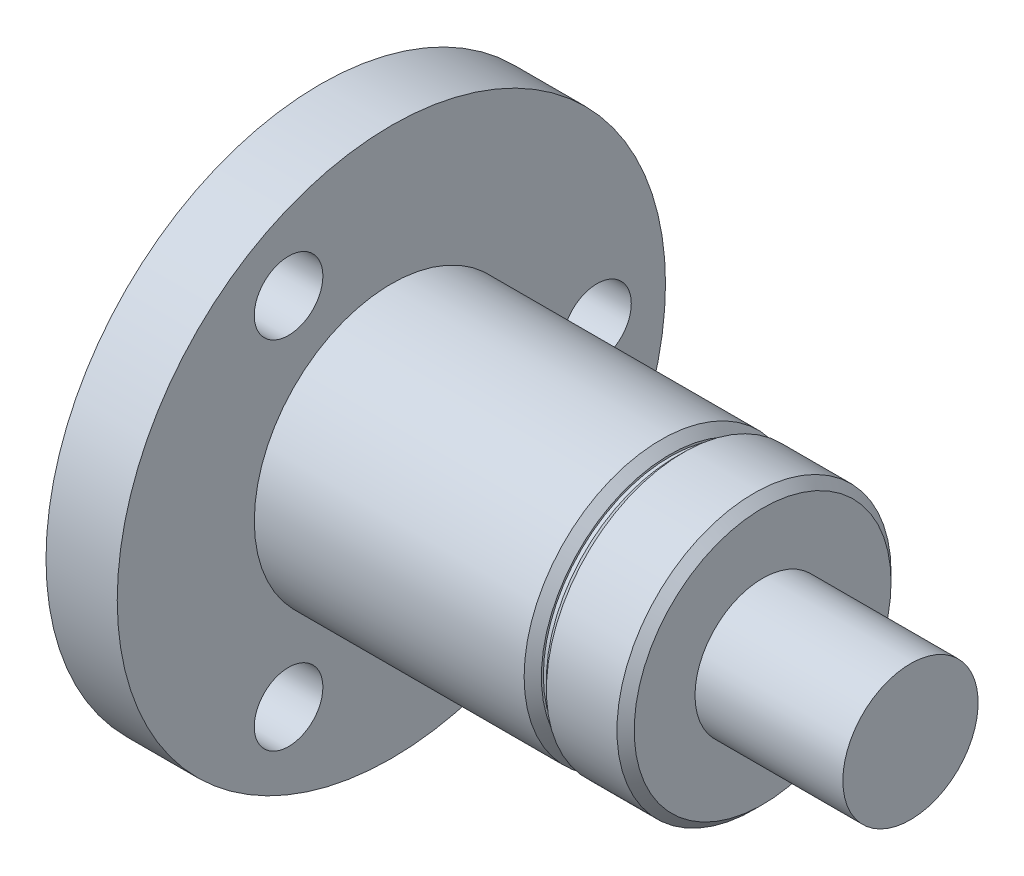
ISO-10303-21;
HEADER;
FILE_DESCRIPTION(('STEP AP214'),'2;1');
FILE_NAME('part.step','',(''),(''),'','','');
FILE_SCHEMA(('AUTOMOTIVE_DESIGN { 1 0 10303 214 1 1 1 1 }'));
ENDSEC;
DATA;
#1=APPLICATION_CONTEXT('core data for automotive mechanical design processes');
#2=APPLICATION_PROTOCOL_DEFINITION('international standard','automotive_design',2000,#1);
#3=PRODUCT_CONTEXT('',#1,'mechanical');
#4=PRODUCT('Part','Part','',(#3));
#5=PRODUCT_RELATED_PRODUCT_CATEGORY('part','',(#4));
#6=PRODUCT_DEFINITION_FORMATION('','',#4);
#7=PRODUCT_DEFINITION_CONTEXT('part definition',#1,'design');
#8=PRODUCT_DEFINITION('design','',#6,#7);
#9=PRODUCT_DEFINITION_SHAPE('','',#8);
#10=(LENGTH_UNIT() NAMED_UNIT(*) SI_UNIT(.MILLI.,.METRE.));
#11=(NAMED_UNIT(*) PLANE_ANGLE_UNIT() SI_UNIT($,.RADIAN.));
#12=(NAMED_UNIT(*) SI_UNIT($,.STERADIAN.) SOLID_ANGLE_UNIT());
#13=UNCERTAINTY_MEASURE_WITH_UNIT(LENGTH_MEASURE(1.E-05),#10,'distance_accuracy_value','');
#14=(GEOMETRIC_REPRESENTATION_CONTEXT(3) GLOBAL_UNCERTAINTY_ASSIGNED_CONTEXT((#13)) GLOBAL_UNIT_ASSIGNED_CONTEXT((#10,
#11,#12)) REPRESENTATION_CONTEXT('',''));
#15=CARTESIAN_POINT('',(0.,0.,0.));
#16=DIRECTION('',(0.,0.,1.));
#17=DIRECTION('',(1.,0.,0.));
#18=AXIS2_PLACEMENT_3D('',#15,#16,#17);
#19=CARTESIAN_POINT('',(-9.6,0.,0.));
#20=DIRECTION('',(1.,0.,0.));
#21=DIRECTION('',(0.,0.,-1.));
#22=AXIS2_PLACEMENT_3D('',#19,#20,#21);
#23=PLANE('',#22);
#24=CARTESIAN_POINT('',(-9.6,0.,0.));
#25=DIRECTION('',(-1.,0.,0.));
#26=DIRECTION('',(0.,0.,1.));
#27=AXIS2_PLACEMENT_3D('',#24,#25,#26);
#28=CIRCLE('',#27,3.13359790887331);
#29=CARTESIAN_POINT('',(-9.6,0.,3.13359790887331));
#30=VERTEX_POINT('',#29);
#31=EDGE_CURVE('E75',#30,#30,#28,.T.);
#32=ORIENTED_EDGE('',*,*,#31,.T.);
#33=EDGE_LOOP('',(#32));
#34=FACE_BOUND('',#33,.T.);
#35=ADVANCED_FACE('F37',(#34),#23,.F.);
#36=CARTESIAN_POINT('',(24.05,0.,0.));
#37=DIRECTION('',(-1.,0.,0.));
#38=DIRECTION('',(0.,0.,1.));
#39=AXIS2_PLACEMENT_3D('',#36,#37,#38);
#40=PLANE('',#39);
#41=CARTESIAN_POINT('',(24.05,0.,0.));
#42=DIRECTION('',(-1.,0.,0.));
#43=DIRECTION('',(0.,0.,1.));
#44=AXIS2_PLACEMENT_3D('',#41,#42,#43);
#45=CIRCLE('',#44,3.13359790887331);
#46=CARTESIAN_POINT('',(24.05,0.,3.13359790887331));
#47=VERTEX_POINT('',#46);
#48=EDGE_CURVE('E63',#47,#47,#45,.T.);
#49=ORIENTED_EDGE('',*,*,#48,.F.);
#50=EDGE_LOOP('',(#49));
#51=FACE_BOUND('',#50,.T.);
#52=ADVANCED_FACE('F135',(#51),#40,.F.);
#53=CARTESIAN_POINT('',(-3.3,0.,0.));
#54=DIRECTION('',(-1.,0.,0.));
#55=DIRECTION('',(0.,0.,1.));
#56=AXIS2_PLACEMENT_3D('',#53,#54,#55);
#57=CYLINDRICAL_SURFACE('',#56,3.13359790887331);
#58=ORIENTED_EDGE('',*,*,#48,.T.);
#59=EDGE_LOOP('',(#58));
#60=FACE_BOUND('',#59,.T.);
#61=CARTESIAN_POINT('',(17.2,0.,0.));
#62=DIRECTION('',(-1.,0.,0.));
#63=DIRECTION('',(0.,0.,1.));
#64=AXIS2_PLACEMENT_3D('',#61,#62,#63);
#65=CIRCLE('',#64,3.13359790887331);
#66=CARTESIAN_POINT('',(17.2,0.,3.13359790887331));
#67=VERTEX_POINT('',#66);
#68=EDGE_CURVE('E78',#67,#67,#65,.T.);
#69=ORIENTED_EDGE('',*,*,#68,.F.);
#70=EDGE_LOOP('',(#69));
#71=FACE_BOUND('',#70,.T.);
#72=ADVANCED_FACE('F141',(#60,#71),#57,.T.);
#73=CARTESIAN_POINT('',(17.2,0.,0.));
#74=DIRECTION('',(1.,0.,0.));
#75=DIRECTION('',(0.,0.,-1.));
#76=AXIS2_PLACEMENT_3D('',#73,#74,#75);
#77=PLANE('',#76);
#78=CARTESIAN_POINT('',(17.2,0.,0.));
#79=DIRECTION('',(1.,0.,0.));
#80=DIRECTION('',(0.,0.,-1.));
#81=AXIS2_PLACEMENT_3D('',#78,#79,#80);
#82=CIRCLE('',#81,5.94999999999999);
#83=CARTESIAN_POINT('',(17.2,0.,-5.94999999999999));
#84=VERTEX_POINT('',#83);
#85=EDGE_CURVE('E52',#84,#84,#82,.T.);
#86=ORIENTED_EDGE('',*,*,#85,.T.);
#87=EDGE_LOOP('',(#86));
#88=FACE_BOUND('',#87,.T.);
#89=ORIENTED_EDGE('',*,*,#68,.T.);
#90=EDGE_LOOP('',(#89));
#91=FACE_BOUND('',#90,.T.);
#92=ADVANCED_FACE('F177',(#88,#91),#77,.T.);
#93=CARTESIAN_POINT('',(-3.3,0.,0.));
#94=DIRECTION('',(-1.,0.,0.));
#95=DIRECTION('',(0.,0.,1.));
#96=AXIS2_PLACEMENT_3D('',#93,#94,#95);
#97=CYLINDRICAL_SURFACE('',#96,6.35);
#98=CARTESIAN_POINT('',(16.8,0.,0.));
#99=DIRECTION('',(1.,0.,0.));
#100=DIRECTION('',(0.,0.,-1.));
#101=AXIS2_PLACEMENT_3D('',#98,#99,#100);
#102=CIRCLE('',#101,6.35);
#103=CARTESIAN_POINT('',(16.8,0.,-6.35));
#104=VERTEX_POINT('',#103);
#105=EDGE_CURVE('E57',#104,#104,#102,.F.);
#106=ORIENTED_EDGE('',*,*,#105,.T.);
#107=EDGE_LOOP('',(#106));
#108=FACE_BOUND('',#107,.T.);
#109=CARTESIAN_POINT('',(13.5322318788082,0.,0.));
#110=DIRECTION('',(-1.,0.,0.));
#111=DIRECTION('',(0.,0.,1.));
#112=AXIS2_PLACEMENT_3D('',#109,#110,#111);
#113=CIRCLE('',#112,6.35);
#114=CARTESIAN_POINT('',(13.5322318788082,0.,-6.35));
#115=VERTEX_POINT('',#114);
#116=EDGE_CURVE('E60',#115,#115,#113,.F.);
#117=ORIENTED_EDGE('',*,*,#116,.T.);
#118=EDGE_LOOP('',(#117));
#119=FACE_BOUND('',#118,.T.);
#120=ADVANCED_FACE('F163',(#108,#119),#97,.T.);
#121=CARTESIAN_POINT('',(13.1322318788082,0.,0.));
#122=DIRECTION('',(-1.,0.,0.));
#123=DIRECTION('',(0.,0.,1.));
#124=AXIS2_PLACEMENT_3D('',#121,#122,#123);
#125=PLANE('',#124);
#126=CARTESIAN_POINT('',(13.1322318788082,0.,0.));
#127=DIRECTION('',(-1.,0.,0.));
#128=DIRECTION('',(0.,0.,1.));
#129=AXIS2_PLACEMENT_3D('',#126,#127,#128);
#130=CIRCLE('',#129,5.95000000000002);
#131=CARTESIAN_POINT('',(13.1322318788082,0.,-5.95000000000002));
#132=VERTEX_POINT('',#131);
#133=EDGE_CURVE('E48',#132,#132,#130,.T.);
#134=ORIENTED_EDGE('',*,*,#133,.T.);
#135=EDGE_LOOP('',(#134));
#136=FACE_BOUND('',#135,.T.);
#137=CARTESIAN_POINT('',(13.1322318788082,0.,0.));
#138=DIRECTION('',(-1.,0.,0.));
#139=DIRECTION('',(0.,0.,1.));
#140=AXIS2_PLACEMENT_3D('',#137,#138,#139);
#141=CIRCLE('',#140,5.85946934559331);
#142=CARTESIAN_POINT('',(13.1322318788082,0.,5.85946934559331));
#143=VERTEX_POINT('',#142);
#144=EDGE_CURVE('E81',#143,#143,#141,.T.);
#145=ORIENTED_EDGE('',*,*,#144,.F.);
#146=EDGE_LOOP('',(#145));
#147=FACE_BOUND('',#146,.T.);
#148=ADVANCED_FACE('F160',(#136,#147),#125,.T.);
#149=CARTESIAN_POINT('',(-3.3,0.,0.));
#150=DIRECTION('',(-1.,0.,0.));
#151=DIRECTION('',(0.,0.,1.));
#152=AXIS2_PLACEMENT_3D('',#149,#150,#151);
#153=CYLINDRICAL_SURFACE('',#152,5.85946934559331);
#154=ORIENTED_EDGE('',*,*,#144,.T.);
#155=EDGE_LOOP('',(#154));
#156=FACE_BOUND('',#155,.T.);
#157=CARTESIAN_POINT('',(12.9,0.,0.));
#158=DIRECTION('',(-1.,0.,0.));
#159=DIRECTION('',(0.,0.,1.));
#160=AXIS2_PLACEMENT_3D('',#157,#158,#159);
#161=CIRCLE('',#160,5.85946934559331);
#162=CARTESIAN_POINT('',(12.9,0.,5.85946934559331));
#163=VERTEX_POINT('',#162);
#164=EDGE_CURVE('E84',#163,#163,#161,.T.);
#165=ORIENTED_EDGE('',*,*,#164,.F.);
#166=EDGE_LOOP('',(#165));
#167=FACE_BOUND('',#166,.T.);
#168=ADVANCED_FACE('F132',(#156,#167),#153,.T.);
#169=CARTESIAN_POINT('',(12.9,0.,0.));
#170=DIRECTION('',(1.,0.,0.));
#171=DIRECTION('',(0.,0.,-1.));
#172=AXIS2_PLACEMENT_3D('',#169,#170,#171);
#173=PLANE('',#172);
#174=CARTESIAN_POINT('',(12.9,0.,0.));
#175=DIRECTION('',(1.,0.,0.));
#176=DIRECTION('',(0.,0.,-1.));
#177=AXIS2_PLACEMENT_3D('',#174,#175,#176);
#178=CIRCLE('',#177,5.95);
#179=CARTESIAN_POINT('',(12.9,0.,-5.95));
#180=VERTEX_POINT('',#179);
#181=EDGE_CURVE('E10',#180,#180,#178,.T.);
#182=ORIENTED_EDGE('',*,*,#181,.T.);
#183=EDGE_LOOP('',(#182));
#184=FACE_BOUND('',#183,.T.);
#185=ORIENTED_EDGE('',*,*,#164,.T.);
#186=EDGE_LOOP('',(#185));
#187=FACE_BOUND('',#186,.T.);
#188=ADVANCED_FACE('F127',(#184,#187),#173,.T.);
#189=CARTESIAN_POINT('',(-3.3,0.,0.));
#190=DIRECTION('',(-1.,0.,0.));
#191=DIRECTION('',(0.,0.,1.));
#192=AXIS2_PLACEMENT_3D('',#189,#190,#191);
#193=CYLINDRICAL_SURFACE('',#192,6.35);
#194=CARTESIAN_POINT('',(12.5,0.,0.));
#195=DIRECTION('',(1.,0.,0.));
#196=DIRECTION('',(0.,0.,-1.));
#197=AXIS2_PLACEMENT_3D('',#194,#195,#196);
#198=CIRCLE('',#197,6.35);
#199=CARTESIAN_POINT('',(12.5,0.,-6.35));
#200=VERTEX_POINT('',#199);
#201=EDGE_CURVE('E44',#200,#200,#198,.F.);
#202=ORIENTED_EDGE('',*,*,#201,.T.);
#203=EDGE_LOOP('',(#202));
#204=FACE_BOUND('',#203,.T.);
#205=CARTESIAN_POINT('',(0.,0.,0.));
#206=DIRECTION('',(-1.,0.,0.));
#207=DIRECTION('',(0.,0.,1.));
#208=AXIS2_PLACEMENT_3D('',#205,#206,#207);
#209=CIRCLE('',#208,6.35);
#210=CARTESIAN_POINT('',(0.,0.,6.35));
#211=VERTEX_POINT('',#210);
#212=EDGE_CURVE('E87',#211,#211,#209,.T.);
#213=ORIENTED_EDGE('',*,*,#212,.F.);
#214=EDGE_LOOP('',(#213));
#215=FACE_BOUND('',#214,.T.);
#216=ADVANCED_FACE('F116',(#204,#215),#193,.T.);
#217=CARTESIAN_POINT('',(0.,0.,0.));
#218=DIRECTION('',(-1.,0.,0.));
#219=DIRECTION('',(0.,0.,1.));
#220=AXIS2_PLACEMENT_3D('',#217,#218,#219);
#221=PLANE('',#220);
#222=CARTESIAN_POINT('',(0.,-8.24889197104676,4.76250000000004));
#223=DIRECTION('',(1.,0.,0.));
#224=DIRECTION('',(0.,-0.866025403784436,0.500000000000004));
#225=AXIS2_PLACEMENT_3D('',#222,#223,#224);
#226=CIRCLE('',#225,1.59);
#227=CARTESIAN_POINT('',(0.,-9.62587236306401,5.55750000000005));
#228=VERTEX_POINT('',#227);
#229=EDGE_CURVE('E71',#228,#228,#226,.T.);
#230=ORIENTED_EDGE('',*,*,#229,.F.);
#231=EDGE_LOOP('',(#230));
#232=FACE_BOUND('',#231,.T.);
#233=CARTESIAN_POINT('',(0.,8.24889197104682,4.76249999999992));
#234=DIRECTION('',(1.,0.,0.));
#235=DIRECTION('',(0.,0.866025403784443,0.499999999999992));
#236=AXIS2_PLACEMENT_3D('',#233,#234,#235);
#237=CIRCLE('',#236,1.59);
#238=CARTESIAN_POINT('',(0.,9.62587236306409,5.55749999999991));
#239=VERTEX_POINT('',#238);
#240=EDGE_CURVE('E103',#239,#239,#237,.T.);
#241=ORIENTED_EDGE('',*,*,#240,.F.);
#242=EDGE_LOOP('',(#241));
#243=FACE_BOUND('',#242,.T.);
#244=CARTESIAN_POINT('',(0.,0.,-9.525));
#245=DIRECTION('',(1.,0.,0.));
#246=DIRECTION('',(0.,0.,-1.));
#247=AXIS2_PLACEMENT_3D('',#244,#245,#246);
#248=CIRCLE('',#247,1.59);
#249=CARTESIAN_POINT('',(0.,0.,-11.115));
#250=VERTEX_POINT('',#249);
#251=EDGE_CURVE('E67',#250,#250,#248,.T.);
#252=ORIENTED_EDGE('',*,*,#251,.F.);
#253=EDGE_LOOP('',(#252));
#254=FACE_BOUND('',#253,.T.);
#255=CARTESIAN_POINT('',(0.,0.,0.));
#256=DIRECTION('',(-1.,0.,0.));
#257=DIRECTION('',(0.,0.,1.));
#258=AXIS2_PLACEMENT_3D('',#255,#256,#257);
#259=CIRCLE('',#258,12.7);
#260=CARTESIAN_POINT('',(0.,0.,12.7));
#261=VERTEX_POINT('',#260);
#262=EDGE_CURVE('E90',#261,#261,#259,.T.);
#263=ORIENTED_EDGE('',*,*,#262,.F.);
#264=EDGE_LOOP('',(#263));
#265=FACE_BOUND('',#264,.T.);
#266=ORIENTED_EDGE('',*,*,#212,.T.);
#267=EDGE_LOOP('',(#266));
#268=FACE_BOUND('',#267,.T.);
#269=ADVANCED_FACE('F112',(#232,#243,#254,#265,#268),#221,.F.);
#270=CARTESIAN_POINT('',(-3.3,0.,0.));
#271=DIRECTION('',(-1.,0.,0.));
#272=DIRECTION('',(0.,0.,1.));
#273=AXIS2_PLACEMENT_3D('',#270,#271,#272);
#274=CYLINDRICAL_SURFACE('',#273,12.7);
#275=CARTESIAN_POINT('',(-3.3,0.,0.));
#276=DIRECTION('',(-1.,0.,0.));
#277=DIRECTION('',(0.,0.,1.));
#278=AXIS2_PLACEMENT_3D('',#275,#276,#277);
#279=CIRCLE('',#278,12.7);
#280=CARTESIAN_POINT('',(-3.3,0.,12.7));
#281=VERTEX_POINT('',#280);
#282=EDGE_CURVE('E93',#281,#281,#279,.T.);
#283=ORIENTED_EDGE('',*,*,#282,.F.);
#284=EDGE_LOOP('',(#283));
#285=FACE_BOUND('',#284,.T.);
#286=ORIENTED_EDGE('',*,*,#262,.T.);
#287=EDGE_LOOP('',(#286));
#288=FACE_BOUND('',#287,.T.);
#289=ADVANCED_FACE('F115',(#285,#288),#274,.T.);
#290=CARTESIAN_POINT('',(-3.3,0.,0.));
#291=DIRECTION('',(1.,0.,0.));
#292=DIRECTION('',(0.,0.,-1.));
#293=AXIS2_PLACEMENT_3D('',#290,#291,#292);
#294=PLANE('',#293);
#295=CARTESIAN_POINT('',(-3.3,-8.24889197104676,4.76250000000004));
#296=DIRECTION('',(1.,0.,0.));
#297=DIRECTION('',(0.,0.,-1.));
#298=AXIS2_PLACEMENT_3D('',#295,#296,#297);
#299=CIRCLE('',#298,1.59);
#300=CARTESIAN_POINT('',(-3.3,-8.24889197104676,3.17250000000004));
#301=VERTEX_POINT('',#300);
#302=EDGE_CURVE('E64',#301,#301,#299,.T.);
#303=ORIENTED_EDGE('',*,*,#302,.T.);
#304=EDGE_LOOP('',(#303));
#305=FACE_BOUND('',#304,.T.);
#306=CARTESIAN_POINT('',(-3.3,8.24889197104682,4.76249999999992));
#307=DIRECTION('',(1.,0.,0.));
#308=DIRECTION('',(0.,0.,-1.));
#309=AXIS2_PLACEMENT_3D('',#306,#307,#308);
#310=CIRCLE('',#309,1.59);
#311=CARTESIAN_POINT('',(-3.3,8.24889197104682,3.17249999999992));
#312=VERTEX_POINT('',#311);
#313=EDGE_CURVE('E68',#312,#312,#310,.T.);
#314=ORIENTED_EDGE('',*,*,#313,.T.);
#315=EDGE_LOOP('',(#314));
#316=FACE_BOUND('',#315,.T.);
#317=CARTESIAN_POINT('',(-3.3,0.,-9.525));
#318=DIRECTION('',(1.,0.,0.));
#319=DIRECTION('',(0.,0.,-1.));
#320=AXIS2_PLACEMENT_3D('',#317,#318,#319);
#321=CIRCLE('',#320,1.59);
#322=CARTESIAN_POINT('',(-3.3,0.,-11.115));
#323=VERTEX_POINT('',#322);
#324=EDGE_CURVE('E72',#323,#323,#321,.T.);
#325=ORIENTED_EDGE('',*,*,#324,.T.);
#326=EDGE_LOOP('',(#325));
#327=FACE_BOUND('',#326,.T.);
#328=CARTESIAN_POINT('',(-3.3,0.,0.));
#329=DIRECTION('',(-1.,0.,0.));
#330=DIRECTION('',(0.,0.,1.));
#331=AXIS2_PLACEMENT_3D('',#328,#329,#330);
#332=CIRCLE('',#331,3.13359790887331);
#333=CARTESIAN_POINT('',(-3.3,0.,3.13359790887331));
#334=VERTEX_POINT('',#333);
#335=EDGE_CURVE('E96',#334,#334,#332,.T.);
#336=ORIENTED_EDGE('',*,*,#335,.F.);
#337=EDGE_LOOP('',(#336));
#338=FACE_BOUND('',#337,.T.);
#339=ORIENTED_EDGE('',*,*,#282,.T.);
#340=EDGE_LOOP('',(#339));
#341=FACE_BOUND('',#340,.T.);
#342=ADVANCED_FACE('F264',(#305,#316,#327,#338,#341),#294,.F.);
#343=CARTESIAN_POINT('',(-3.3,0.,0.));
#344=DIRECTION('',(-1.,0.,0.));
#345=DIRECTION('',(0.,0.,1.));
#346=AXIS2_PLACEMENT_3D('',#343,#344,#345);
#347=CYLINDRICAL_SURFACE('',#346,3.13359790887331);
#348=ORIENTED_EDGE('',*,*,#335,.T.);
#349=EDGE_LOOP('',(#348));
#350=FACE_BOUND('',#349,.T.);
#351=ORIENTED_EDGE('',*,*,#31,.F.);
#352=EDGE_LOOP('',(#351));
#353=FACE_BOUND('',#352,.T.);
#354=ADVANCED_FACE('F255',(#350,#353),#347,.T.);
#355=CARTESIAN_POINT('',(-10.,0.,-9.525));
#356=DIRECTION('',(1.,0.,0.));
#357=DIRECTION('',(0.,0.,-1.));
#358=AXIS2_PLACEMENT_3D('',#355,#356,#357);
#359=CYLINDRICAL_SURFACE('',#358,1.59);
#360=ORIENTED_EDGE('',*,*,#251,.T.);
#361=EDGE_LOOP('',(#360));
#362=FACE_BOUND('',#361,.T.);
#363=ORIENTED_EDGE('',*,*,#324,.F.);
#364=EDGE_LOOP('',(#363));
#365=FACE_BOUND('',#364,.T.);
#366=ADVANCED_FACE('F246',(#362,#365),#359,.F.);
#367=CARTESIAN_POINT('',(-10.,8.24889197104682,4.76249999999992));
#368=DIRECTION('',(1.,0.,0.));
#369=DIRECTION('',(0.,0.,-1.));
#370=AXIS2_PLACEMENT_3D('',#367,#368,#369);
#371=CYLINDRICAL_SURFACE('',#370,1.59);
#372=ORIENTED_EDGE('',*,*,#240,.T.);
#373=EDGE_LOOP('',(#372));
#374=FACE_BOUND('',#373,.T.);
#375=ORIENTED_EDGE('',*,*,#313,.F.);
#376=EDGE_LOOP('',(#375));
#377=FACE_BOUND('',#376,.T.);
#378=ADVANCED_FACE('F240',(#374,#377),#371,.F.);
#379=CARTESIAN_POINT('',(-10.,-8.24889197104676,4.76250000000004));
#380=DIRECTION('',(1.,0.,0.));
#381=DIRECTION('',(0.,0.,-1.));
#382=AXIS2_PLACEMENT_3D('',#379,#380,#381);
#383=CYLINDRICAL_SURFACE('',#382,1.59);
#384=ORIENTED_EDGE('',*,*,#229,.T.);
#385=EDGE_LOOP('',(#384));
#386=FACE_BOUND('',#385,.T.);
#387=ORIENTED_EDGE('',*,*,#302,.F.);
#388=EDGE_LOOP('',(#387));
#389=FACE_BOUND('',#388,.T.);
#390=ADVANCED_FACE('F109',(#386,#389),#383,.F.);
#391=CARTESIAN_POINT('',(16.8,0.,0.));
#392=DIRECTION('',(-1.,0.,0.));
#393=DIRECTION('',(0.,0.,1.));
#394=AXIS2_PLACEMENT_3D('',#391,#392,#393);
#395=CONICAL_SURFACE('',#394,6.35,0.785398163397446);
#396=ORIENTED_EDGE('',*,*,#85,.F.);
#397=EDGE_LOOP('',(#396));
#398=FACE_BOUND('',#397,.T.);
#399=ORIENTED_EDGE('',*,*,#105,.F.);
#400=EDGE_LOOP('',(#399));
#401=FACE_BOUND('',#400,.T.);
#402=ADVANCED_FACE('F146',(#398,#401),#395,.T.);
#403=CARTESIAN_POINT('',(13.1322318788082,0.,0.));
#404=DIRECTION('',(1.,0.,0.));
#405=DIRECTION('',(0.,0.,-1.));
#406=AXIS2_PLACEMENT_3D('',#403,#404,#405);
#407=CONICAL_SURFACE('',#406,5.95000000000002,0.785398163397442);
#408=CARTESIAN_POINT('',(13.5322318788082,0.,-6.35));
#409=CARTESIAN_POINT('',(13.5280652121416,0.,-6.34583333333333));
#410=CARTESIAN_POINT('',(13.5238985454749,0.,-6.34166666666667));
#411=CARTESIAN_POINT('',(13.5155652121416,0.,-6.33333333333333));
#412=CARTESIAN_POINT('',(13.5113985454749,0.,-6.32916666666667));
#413=CARTESIAN_POINT('',(13.5030652121416,0.,-6.32083333333334));
#414=CARTESIAN_POINT('',(13.4988985454749,0.,-6.31666666666667));
#415=CARTESIAN_POINT('',(13.4905652121416,0.,-6.30833333333334));
#416=CARTESIAN_POINT('',(13.4863985454749,0.,-6.30416666666667));
#417=CARTESIAN_POINT('',(13.4780652121416,0.,-6.29583333333334));
#418=CARTESIAN_POINT('',(13.4738985454749,0.,-6.29166666666667));
#419=CARTESIAN_POINT('',(13.4655652121416,0.,-6.28333333333334));
#420=CARTESIAN_POINT('',(13.4613985454749,0.,-6.27916666666667));
#421=CARTESIAN_POINT('',(13.4530652121416,0.,-6.27083333333334));
#422=CARTESIAN_POINT('',(13.4488985454749,0.,-6.26666666666667));
#423=CARTESIAN_POINT('',(13.4405652121416,0.,-6.25833333333334));
#424=CARTESIAN_POINT('',(13.4363985454749,0.,-6.25416666666667));
#425=CARTESIAN_POINT('',(13.4280652121416,0.,-6.24583333333334));
#426=CARTESIAN_POINT('',(13.4238985454749,0.,-6.24166666666667));
#427=CARTESIAN_POINT('',(13.4155652121416,0.,-6.23333333333334));
#428=CARTESIAN_POINT('',(13.4113985454749,0.,-6.22916666666667));
#429=CARTESIAN_POINT('',(13.4030652121416,0.,-6.22083333333334));
#430=CARTESIAN_POINT('',(13.3988985454749,0.,-6.21666666666667));
#431=CARTESIAN_POINT('',(13.3905652121416,0.,-6.20833333333334));
#432=CARTESIAN_POINT('',(13.3863985454749,0.,-6.20416666666667));
#433=CARTESIAN_POINT('',(13.3780652121416,0.,-6.19583333333334));
#434=CARTESIAN_POINT('',(13.3738985454749,0.,-6.19166666666667));
#435=CARTESIAN_POINT('',(13.3655652121416,0.,-6.18333333333334));
#436=CARTESIAN_POINT('',(13.3613985454749,0.,-6.17916666666668));
#437=CARTESIAN_POINT('',(13.3530652121416,0.,-6.17083333333334));
#438=CARTESIAN_POINT('',(13.3488985454749,0.,-6.16666666666667));
#439=CARTESIAN_POINT('',(13.3405652121416,0.,-6.15833333333334));
#440=CARTESIAN_POINT('',(13.3363985454749,0.,-6.15416666666668));
#441=CARTESIAN_POINT('',(13.3280652121416,0.,-6.14583333333334));
#442=CARTESIAN_POINT('',(13.3238985454749,0.,-6.14166666666668));
#443=CARTESIAN_POINT('',(13.3155652121416,0.,-6.13333333333334));
#444=CARTESIAN_POINT('',(13.3113985454749,0.,-6.12916666666668));
#445=CARTESIAN_POINT('',(13.3030652121416,0.,-6.12083333333334));
#446=CARTESIAN_POINT('',(13.2988985454749,0.,-6.11666666666668));
#447=CARTESIAN_POINT('',(13.2905652121416,0.,-6.10833333333334));
#448=CARTESIAN_POINT('',(13.2863985454749,0.,-6.10416666666668));
#449=CARTESIAN_POINT('',(13.2780652121416,0.,-6.09583333333335));
#450=CARTESIAN_POINT('',(13.2738985454749,0.,-6.09166666666668));
#451=CARTESIAN_POINT('',(13.2655652121416,0.,-6.08333333333335));
#452=CARTESIAN_POINT('',(13.2613985454749,0.,-6.07916666666668));
#453=CARTESIAN_POINT('',(13.2530652121416,0.,-6.07083333333335));
#454=CARTESIAN_POINT('',(13.2488985454749,0.,-6.06666666666668));
#455=CARTESIAN_POINT('',(13.2405652121416,0.,-6.05833333333335));
#456=CARTESIAN_POINT('',(13.2363985454749,0.,-6.05416666666668));
#457=CARTESIAN_POINT('',(13.2280652121416,0.,-6.04583333333335));
#458=CARTESIAN_POINT('',(13.2238985454749,0.,-6.04166666666668));
#459=CARTESIAN_POINT('',(13.2155652121416,0.,-6.03333333333335));
#460=CARTESIAN_POINT('',(13.2113985454749,0.,-6.02916666666668));
#461=CARTESIAN_POINT('',(13.2030652121416,0.,-6.02083333333335));
#462=CARTESIAN_POINT('',(13.1988985454749,0.,-6.01666666666668));
#463=CARTESIAN_POINT('',(13.1905652121416,0.,-6.00833333333335));
#464=CARTESIAN_POINT('',(13.1863985454749,0.,-6.00416666666668));
#465=CARTESIAN_POINT('',(13.1780652121416,0.,-5.99583333333335));
#466=CARTESIAN_POINT('',(13.1738985454749,0.,-5.99166666666668));
#467=CARTESIAN_POINT('',(13.1655652121416,0.,-5.98333333333335));
#468=CARTESIAN_POINT('',(13.1613985454749,0.,-5.97916666666668));
#469=CARTESIAN_POINT('',(13.1530652121416,0.,-5.97083333333335));
#470=CARTESIAN_POINT('',(13.1488985454749,0.,-5.96666666666668));
#471=CARTESIAN_POINT('',(13.1405652121416,0.,-5.95833333333335));
#472=CARTESIAN_POINT('',(13.1363985454749,0.,-5.95416666666669));
#473=CARTESIAN_POINT('',(13.1322318788082,0.,-5.95000000000002));
#474=B_SPLINE_CURVE_WITH_KNOTS('',3,(#408,#409,#410,#411,#412,#413,#414,#415,#416,#417,#418,
#419,#420,#421,#422,#423,#424,#425,#426,#427,#428,#429,#430,#431,#432,#433,#434,#435,#436,#437,
#438,#439,#440,#441,#442,#443,#444,#445,#446,#447,#448,#449,#450,#451,#452,#453,#454,#455,#456,
#457,#458,#459,#460,#461,#462,#463,#464,#465,#466,#467,#468,#469,#470,#471,#472,#473),
.UNSPECIFIED.,.F.,.F.,(4,2,2,2,2,2,2,2,2,2,2,2,2,2,2,2,2,2,2,2,2,2,2,2,2,2,2,2,2,2,2,2,4),(0.,
0.0176776695296636,0.0353553390593272,0.0530330085889895,0.0707106781186531,0.0883883476483154,
0.106066017177978,0.123743686707641,0.141421356237304,0.159099025766968,0.17677669529663,
0.194454364826294,0.212132034355956,0.22980970388562,0.247487373415282,0.265165042944946,
0.282842712474608,0.300520382004272,0.318198051533935,0.335875721063598,0.353553390593261,
0.371231060122924,0.388908729652587,0.406586399182249,0.424264068711913,0.441941738241576,
0.459619407771238,0.477297077300902,0.494974746830564,0.512652416360228,0.53033008588989,
0.548007755419554,0.565685424949218),.UNSPECIFIED.);
#475=EDGE_CURVE('BSEAM148',#115,#132,#474,.T.);
#476=ORIENTED_EDGE('',*,*,#116,.F.);
#477=ORIENTED_EDGE('',*,*,#133,.F.);
#478=ORIENTED_EDGE('',*,*,#475,.T.);
#479=ORIENTED_EDGE('',*,*,#475,.F.);
#480=EDGE_LOOP('',(#476,#478,#477,#479));
#481=FACE_BOUND('',#480,.T.);
#482=ADVANCED_FACE('F148',(#481),#407,.T.);
#483=CARTESIAN_POINT('',(12.5,0.,0.));
#484=DIRECTION('',(-1.,0.,0.));
#485=DIRECTION('',(0.,0.,1.));
#486=AXIS2_PLACEMENT_3D('',#483,#484,#485);
#487=CONICAL_SURFACE('',#486,6.35,0.785398163397447);
#488=ORIENTED_EDGE('',*,*,#181,.F.);
#489=EDGE_LOOP('',(#488));
#490=FACE_BOUND('',#489,.T.);
#491=ORIENTED_EDGE('',*,*,#201,.F.);
#492=EDGE_LOOP('',(#491));
#493=FACE_BOUND('',#492,.T.);
#494=ADVANCED_FACE('F39',(#490,#493),#487,.T.);
#495=CLOSED_SHELL('',(#35,#52,#72,#92,#120,#148,#168,#188,#216,#269,#289,#342,#354,#366,#378,
#390,#402,#482,#494));
#496=MANIFOLD_SOLID_BREP('B2',#495);
#497=ADVANCED_BREP_SHAPE_REPRESENTATION('',(#18,#496),#14);
#498=SHAPE_DEFINITION_REPRESENTATION(#9,#497);
ENDSEC;
END-ISO-10303-21;
